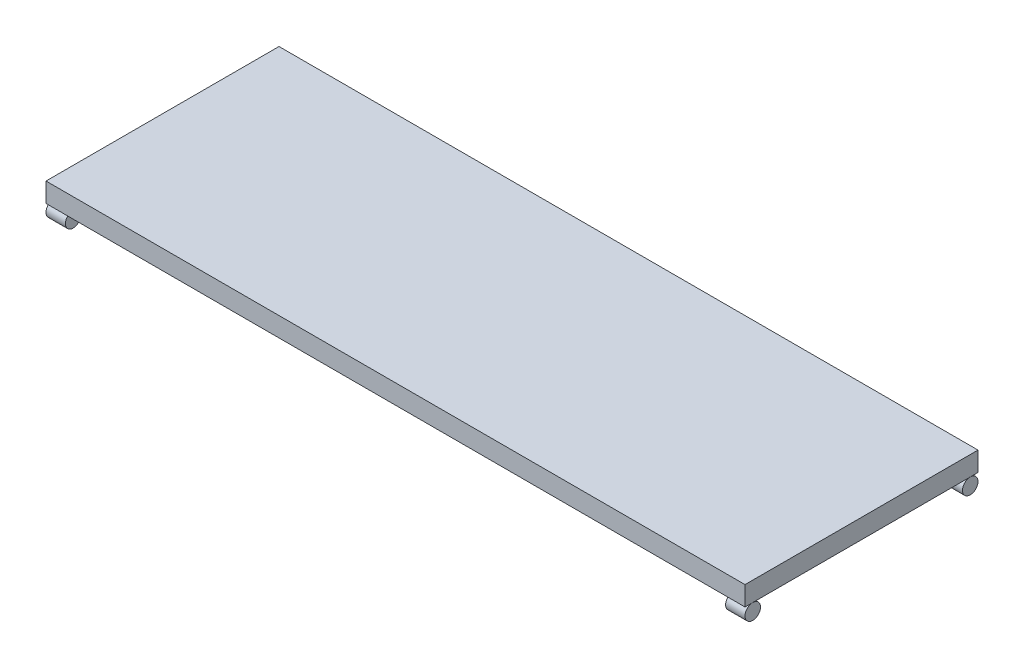
ISO-10303-21;
HEADER;
FILE_DESCRIPTION(('STEP AP214'),'2;1');
FILE_NAME('part.step','',(''),(''),'','','');
FILE_SCHEMA(('AUTOMOTIVE_DESIGN { 1 0 10303 214 1 1 1 1 }'));
ENDSEC;
DATA;
#1=APPLICATION_CONTEXT('core data for automotive mechanical design processes');
#2=APPLICATION_PROTOCOL_DEFINITION('international standard','automotive_design',2000,#1);
#3=PRODUCT_CONTEXT('',#1,'mechanical');
#4=PRODUCT('Part','Part','',(#3));
#5=PRODUCT_RELATED_PRODUCT_CATEGORY('part','',(#4));
#6=PRODUCT_DEFINITION_FORMATION('','',#4);
#7=PRODUCT_DEFINITION_CONTEXT('part definition',#1,'design');
#8=PRODUCT_DEFINITION('design','',#6,#7);
#9=PRODUCT_DEFINITION_SHAPE('','',#8);
#10=(LENGTH_UNIT() NAMED_UNIT(*) SI_UNIT(.MILLI.,.METRE.));
#11=(NAMED_UNIT(*) PLANE_ANGLE_UNIT() SI_UNIT($,.RADIAN.));
#12=(NAMED_UNIT(*) SI_UNIT($,.STERADIAN.) SOLID_ANGLE_UNIT());
#13=UNCERTAINTY_MEASURE_WITH_UNIT(LENGTH_MEASURE(1.E-05),#10,'distance_accuracy_value','');
#14=(GEOMETRIC_REPRESENTATION_CONTEXT(3) GLOBAL_UNCERTAINTY_ASSIGNED_CONTEXT((#13)) GLOBAL_UNIT_ASSIGNED_CONTEXT((#10,
#11,#12)) REPRESENTATION_CONTEXT('',''));
#15=CARTESIAN_POINT('',(0.,0.,0.));
#16=DIRECTION('',(0.,0.,1.));
#17=DIRECTION('',(1.,0.,0.));
#18=AXIS2_PLACEMENT_3D('',#15,#16,#17);
#19=CARTESIAN_POINT('',(1750.,-20.,-580.));
#20=DIRECTION('',(1.,0.,0.));
#21=DIRECTION('',(0.,0.,-1.));
#22=AXIS2_PLACEMENT_3D('',#19,#20,#21);
#23=CYLINDRICAL_SURFACE('',#22,20.);
#24=CARTESIAN_POINT('',(1750.,-20.,-580.));
#25=DIRECTION('',(1.,0.,0.));
#26=DIRECTION('',(0.,0.,-1.));
#27=AXIS2_PLACEMENT_3D('',#24,#25,#26);
#28=CIRCLE('',#27,20.);
#29=CARTESIAN_POINT('',(1750.,-20.,-600.));
#30=VERTEX_POINT('',#29);
#31=EDGE_CURVE('E11',#30,#30,#28,.T.);
#32=ORIENTED_EDGE('',*,*,#31,.T.);
#33=EDGE_LOOP('',(#32));
#34=FACE_BOUND('',#33,.T.);
#35=CARTESIAN_POINT('',(1800.,-20.,-580.));
#36=DIRECTION('',(1.,0.,0.));
#37=DIRECTION('',(0.,0.,-1.));
#38=AXIS2_PLACEMENT_3D('',#35,#36,#37);
#39=CIRCLE('',#38,20.);
#40=CARTESIAN_POINT('',(1800.,-20.,-600.));
#41=VERTEX_POINT('',#40);
#42=EDGE_CURVE('E45',#41,#41,#39,.T.);
#43=ORIENTED_EDGE('',*,*,#42,.F.);
#44=EDGE_LOOP('',(#43));
#45=FACE_BOUND('',#44,.T.);
#46=ADVANCED_FACE('F42',(#34,#45),#23,.T.);
#47=CARTESIAN_POINT('',(1750.,-20.,-580.));
#48=DIRECTION('',(1.,0.,0.));
#49=DIRECTION('',(0.,0.,-1.));
#50=AXIS2_PLACEMENT_3D('',#47,#48,#49);
#51=PLANE('',#50);
#52=ORIENTED_EDGE('',*,*,#31,.F.);
#53=EDGE_LOOP('',(#52));
#54=FACE_BOUND('',#53,.T.);
#55=ADVANCED_FACE('F57',(#54),#51,.F.);
#56=CARTESIAN_POINT('',(1800.,-20.,-580.));
#57=DIRECTION('',(1.,0.,0.));
#58=DIRECTION('',(0.,0.,-1.));
#59=AXIS2_PLACEMENT_3D('',#56,#57,#58);
#60=PLANE('',#59);
#61=ORIENTED_EDGE('',*,*,#42,.T.);
#62=EDGE_LOOP('',(#61));
#63=FACE_BOUND('',#62,.T.);
#64=ADVANCED_FACE('F54',(#63),#60,.T.);
#65=CLOSED_SHELL('',(#46,#55,#64));
#66=MANIFOLD_SOLID_BREP('B2',#65);
#67=CARTESIAN_POINT('',(1750.,-20.,-20.));
#68=DIRECTION('',(1.,0.,0.));
#69=DIRECTION('',(0.,0.,-1.));
#70=AXIS2_PLACEMENT_3D('',#67,#68,#69);
#71=CYLINDRICAL_SURFACE('',#70,20.);
#72=CARTESIAN_POINT('',(1750.,-20.,-20.));
#73=DIRECTION('',(1.,0.,0.));
#74=DIRECTION('',(0.,0.,-1.));
#75=AXIS2_PLACEMENT_3D('',#72,#73,#74);
#76=CIRCLE('',#75,20.);
#77=CARTESIAN_POINT('',(1750.,-20.,-40.));
#78=VERTEX_POINT('',#77);
#79=EDGE_CURVE('E41',#78,#78,#76,.T.);
#80=ORIENTED_EDGE('',*,*,#79,.T.);
#81=EDGE_LOOP('',(#80));
#82=FACE_BOUND('',#81,.T.);
#83=CARTESIAN_POINT('',(1800.,-20.,-20.));
#84=DIRECTION('',(1.,0.,0.));
#85=DIRECTION('',(0.,0.,-1.));
#86=AXIS2_PLACEMENT_3D('',#83,#84,#85);
#87=CIRCLE('',#86,20.);
#88=CARTESIAN_POINT('',(1800.,-20.,-40.));
#89=VERTEX_POINT('',#88);
#90=EDGE_CURVE('E94',#89,#89,#87,.T.);
#91=ORIENTED_EDGE('',*,*,#90,.F.);
#92=EDGE_LOOP('',(#91));
#93=FACE_BOUND('',#92,.T.);
#94=ADVANCED_FACE('F91',(#82,#93),#71,.T.);
#95=CARTESIAN_POINT('',(1750.,-20.,-20.));
#96=DIRECTION('',(1.,0.,0.));
#97=DIRECTION('',(0.,0.,-1.));
#98=AXIS2_PLACEMENT_3D('',#95,#96,#97);
#99=PLANE('',#98);
#100=ORIENTED_EDGE('',*,*,#79,.F.);
#101=EDGE_LOOP('',(#100));
#102=FACE_BOUND('',#101,.T.);
#103=ADVANCED_FACE('F106',(#102),#99,.F.);
#104=CARTESIAN_POINT('',(1800.,-20.,-20.));
#105=DIRECTION('',(1.,0.,0.));
#106=DIRECTION('',(0.,0.,-1.));
#107=AXIS2_PLACEMENT_3D('',#104,#105,#106);
#108=PLANE('',#107);
#109=ORIENTED_EDGE('',*,*,#90,.T.);
#110=EDGE_LOOP('',(#109));
#111=FACE_BOUND('',#110,.T.);
#112=ADVANCED_FACE('F103',(#111),#108,.T.);
#113=CLOSED_SHELL('',(#94,#103,#112));
#114=MANIFOLD_SOLID_BREP('B6',#113);
#115=CARTESIAN_POINT('',(50.,-20.,-580.));
#116=DIRECTION('',(-1.,0.,0.));
#117=DIRECTION('',(0.,0.,1.));
#118=AXIS2_PLACEMENT_3D('',#115,#116,#117);
#119=CYLINDRICAL_SURFACE('',#118,20.);
#120=CARTESIAN_POINT('',(50.,-20.,-580.));
#121=DIRECTION('',(1.,0.,0.));
#122=DIRECTION('',(0.,0.,-1.));
#123=AXIS2_PLACEMENT_3D('',#120,#121,#122);
#124=CIRCLE('',#123,20.);
#125=CARTESIAN_POINT('',(50.,-20.,-600.));
#126=VERTEX_POINT('',#125);
#127=EDGE_CURVE('E90',#126,#126,#124,.T.);
#128=ORIENTED_EDGE('',*,*,#127,.F.);
#129=EDGE_LOOP('',(#128));
#130=FACE_BOUND('',#129,.T.);
#131=CARTESIAN_POINT('',(0.,-20.,-580.));
#132=DIRECTION('',(1.,0.,0.));
#133=DIRECTION('',(0.,0.,-1.));
#134=AXIS2_PLACEMENT_3D('',#131,#132,#133);
#135=CIRCLE('',#134,20.);
#136=CARTESIAN_POINT('',(0.,-20.,-600.));
#137=VERTEX_POINT('',#136);
#138=EDGE_CURVE('E143',#137,#137,#135,.T.);
#139=ORIENTED_EDGE('',*,*,#138,.T.);
#140=EDGE_LOOP('',(#139));
#141=FACE_BOUND('',#140,.T.);
#142=ADVANCED_FACE('F140',(#130,#141),#119,.T.);
#143=CARTESIAN_POINT('',(50.,-20.,-580.));
#144=DIRECTION('',(1.,0.,0.));
#145=DIRECTION('',(0.,0.,-1.));
#146=AXIS2_PLACEMENT_3D('',#143,#144,#145);
#147=PLANE('',#146);
#148=ORIENTED_EDGE('',*,*,#127,.T.);
#149=EDGE_LOOP('',(#148));
#150=FACE_BOUND('',#149,.T.);
#151=ADVANCED_FACE('F155',(#150),#147,.T.);
#152=CARTESIAN_POINT('',(0.,-20.,-580.));
#153=DIRECTION('',(1.,0.,0.));
#154=DIRECTION('',(0.,0.,-1.));
#155=AXIS2_PLACEMENT_3D('',#152,#153,#154);
#156=PLANE('',#155);
#157=ORIENTED_EDGE('',*,*,#138,.F.);
#158=EDGE_LOOP('',(#157));
#159=FACE_BOUND('',#158,.T.);
#160=ADVANCED_FACE('F153',(#159),#156,.F.);
#161=CLOSED_SHELL('',(#142,#151,#160));
#162=MANIFOLD_SOLID_BREP('B36',#161);
#163=CARTESIAN_POINT('',(50.,-20.,-20.));
#164=DIRECTION('',(-1.,0.,0.));
#165=DIRECTION('',(0.,0.,1.));
#166=AXIS2_PLACEMENT_3D('',#163,#164,#165);
#167=CYLINDRICAL_SURFACE('',#166,20.);
#168=CARTESIAN_POINT('',(50.,-20.,-20.));
#169=DIRECTION('',(1.,0.,0.));
#170=DIRECTION('',(0.,0.,-1.));
#171=AXIS2_PLACEMENT_3D('',#168,#169,#170);
#172=CIRCLE('',#171,20.);
#173=CARTESIAN_POINT('',(50.,-20.,-40.));
#174=VERTEX_POINT('',#173);
#175=EDGE_CURVE('E139',#174,#174,#172,.T.);
#176=ORIENTED_EDGE('',*,*,#175,.F.);
#177=EDGE_LOOP('',(#176));
#178=FACE_BOUND('',#177,.T.);
#179=CARTESIAN_POINT('',(0.,-20.,-20.));
#180=DIRECTION('',(1.,0.,0.));
#181=DIRECTION('',(0.,0.,-1.));
#182=AXIS2_PLACEMENT_3D('',#179,#180,#181);
#183=CIRCLE('',#182,20.);
#184=CARTESIAN_POINT('',(0.,-20.,-40.));
#185=VERTEX_POINT('',#184);
#186=EDGE_CURVE('E193',#185,#185,#183,.T.);
#187=ORIENTED_EDGE('',*,*,#186,.T.);
#188=EDGE_LOOP('',(#187));
#189=FACE_BOUND('',#188,.T.);
#190=ADVANCED_FACE('F190',(#178,#189),#167,.T.);
#191=CARTESIAN_POINT('',(50.,-20.,-20.));
#192=DIRECTION('',(1.,0.,0.));
#193=DIRECTION('',(0.,0.,-1.));
#194=AXIS2_PLACEMENT_3D('',#191,#192,#193);
#195=PLANE('',#194);
#196=ORIENTED_EDGE('',*,*,#175,.T.);
#197=EDGE_LOOP('',(#196));
#198=FACE_BOUND('',#197,.T.);
#199=ADVANCED_FACE('F205',(#198),#195,.T.);
#200=CARTESIAN_POINT('',(0.,-20.,-20.));
#201=DIRECTION('',(1.,0.,0.));
#202=DIRECTION('',(0.,0.,-1.));
#203=AXIS2_PLACEMENT_3D('',#200,#201,#202);
#204=PLANE('',#203);
#205=ORIENTED_EDGE('',*,*,#186,.F.);
#206=EDGE_LOOP('',(#205));
#207=FACE_BOUND('',#206,.T.);
#208=ADVANCED_FACE('F203',(#207),#204,.F.);
#209=CLOSED_SHELL('',(#190,#199,#208));
#210=MANIFOLD_SOLID_BREP('B85',#209);
#211=CARTESIAN_POINT('',(0.,50.,0.));
#212=DIRECTION('',(1.,0.,0.));
#213=DIRECTION('',(0.,0.,-1.));
#214=AXIS2_PLACEMENT_3D('',#211,#212,#213);
#215=PLANE('',#214);
#216=DIRECTION('',(0.,0.,1.));
#217=VECTOR('',#216,1.);
#218=CARTESIAN_POINT('',(0.,0.,0.));
#219=LINE('',#218,#217);
#220=CARTESIAN_POINT('',(0.,0.,-600.));
#221=VERTEX_POINT('',#220);
#222=CARTESIAN_POINT('',(0.,0.,0.));
#223=VERTEX_POINT('',#222);
#224=EDGE_CURVE('E295',#221,#223,#219,.T.);
#225=ORIENTED_EDGE('',*,*,#224,.T.);
#226=DIRECTION('',(0.,-1.,0.));
#227=VECTOR('',#226,1.);
#228=CARTESIAN_POINT('',(0.,50.,0.));
#229=LINE('',#228,#227);
#230=CARTESIAN_POINT('',(0.,50.,0.));
#231=VERTEX_POINT('',#230);
#232=EDGE_CURVE('E188',#231,#223,#229,.T.);
#233=ORIENTED_EDGE('',*,*,#232,.F.);
#234=DIRECTION('',(0.,0.,1.));
#235=VECTOR('',#234,1.);
#236=CARTESIAN_POINT('',(0.,50.,0.));
#237=LINE('',#236,#235);
#238=CARTESIAN_POINT('',(0.,50.,-600.));
#239=VERTEX_POINT('',#238);
#240=EDGE_CURVE('E282',#239,#231,#237,.T.);
#241=ORIENTED_EDGE('',*,*,#240,.F.);
#242=DIRECTION('',(0.,-1.,0.));
#243=VECTOR('',#242,1.);
#244=CARTESIAN_POINT('',(0.,50.,-600.));
#245=LINE('',#244,#243);
#246=EDGE_CURVE('E291',#239,#221,#245,.T.);
#247=ORIENTED_EDGE('',*,*,#246,.T.);
#248=EDGE_LOOP('',(#225,#233,#241,#247));
#249=FACE_BOUND('',#248,.T.);
#250=ADVANCED_FACE('F231',(#249),#215,.F.);
#251=CARTESIAN_POINT('',(0.,50.,0.));
#252=DIRECTION('',(0.,0.,-1.));
#253=DIRECTION('',(-1.,0.,0.));
#254=AXIS2_PLACEMENT_3D('',#251,#252,#253);
#255=PLANE('',#254);
#256=DIRECTION('',(1.,0.,0.));
#257=VECTOR('',#256,1.);
#258=CARTESIAN_POINT('',(0.,0.,0.));
#259=LINE('',#258,#257);
#260=CARTESIAN_POINT('',(1800.,0.,0.));
#261=VERTEX_POINT('',#260);
#262=EDGE_CURVE('E287',#223,#261,#259,.T.);
#263=ORIENTED_EDGE('',*,*,#262,.T.);
#264=DIRECTION('',(0.,-1.,0.));
#265=VECTOR('',#264,1.);
#266=CARTESIAN_POINT('',(1800.,50.,0.));
#267=LINE('',#266,#265);
#268=CARTESIAN_POINT('',(1800.,50.,0.));
#269=VERTEX_POINT('',#268);
#270=EDGE_CURVE('E239',#269,#261,#267,.T.);
#271=ORIENTED_EDGE('',*,*,#270,.F.);
#272=DIRECTION('',(1.,0.,0.));
#273=VECTOR('',#272,1.);
#274=CARTESIAN_POINT('',(0.,50.,0.));
#275=LINE('',#274,#273);
#276=EDGE_CURVE('E277',#231,#269,#275,.T.);
#277=ORIENTED_EDGE('',*,*,#276,.F.);
#278=ORIENTED_EDGE('',*,*,#232,.T.);
#279=EDGE_LOOP('',(#263,#271,#277,#278));
#280=FACE_BOUND('',#279,.T.);
#281=ADVANCED_FACE('F285',(#280),#255,.F.);
#282=CARTESIAN_POINT('',(1800.,50.,0.));
#283=DIRECTION('',(-1.,0.,0.));
#284=DIRECTION('',(0.,0.,1.));
#285=AXIS2_PLACEMENT_3D('',#282,#283,#284);
#286=PLANE('',#285);
#287=DIRECTION('',(0.,0.,-1.));
#288=VECTOR('',#287,1.);
#289=CARTESIAN_POINT('',(1800.,0.,0.));
#290=LINE('',#289,#288);
#291=CARTESIAN_POINT('',(1800.,0.,-600.));
#292=VERTEX_POINT('',#291);
#293=EDGE_CURVE('E264',#261,#292,#290,.T.);
#294=ORIENTED_EDGE('',*,*,#293,.T.);
#295=DIRECTION('',(0.,-1.,0.));
#296=VECTOR('',#295,1.);
#297=CARTESIAN_POINT('',(1800.,50.,-600.));
#298=LINE('',#297,#296);
#299=CARTESIAN_POINT('',(1800.,50.,-600.));
#300=VERTEX_POINT('',#299);
#301=EDGE_CURVE('E288',#300,#292,#298,.T.);
#302=ORIENTED_EDGE('',*,*,#301,.F.);
#303=DIRECTION('',(0.,0.,-1.));
#304=VECTOR('',#303,1.);
#305=CARTESIAN_POINT('',(1800.,50.,0.));
#306=LINE('',#305,#304);
#307=EDGE_CURVE('E280',#269,#300,#306,.T.);
#308=ORIENTED_EDGE('',*,*,#307,.F.);
#309=ORIENTED_EDGE('',*,*,#270,.T.);
#310=EDGE_LOOP('',(#294,#302,#308,#309));
#311=FACE_BOUND('',#310,.T.);
#312=ADVANCED_FACE('F289',(#311),#286,.F.);
#313=CARTESIAN_POINT('',(0.,50.,-600.));
#314=DIRECTION('',(0.,0.,1.));
#315=DIRECTION('',(1.,0.,0.));
#316=AXIS2_PLACEMENT_3D('',#313,#314,#315);
#317=PLANE('',#316);
#318=DIRECTION('',(-1.,0.,0.));
#319=VECTOR('',#318,1.);
#320=CARTESIAN_POINT('',(0.,0.,-600.));
#321=LINE('',#320,#319);
#322=EDGE_CURVE('E270',#292,#221,#321,.T.);
#323=ORIENTED_EDGE('',*,*,#322,.T.);
#324=ORIENTED_EDGE('',*,*,#246,.F.);
#325=DIRECTION('',(-1.,0.,0.));
#326=VECTOR('',#325,1.);
#327=CARTESIAN_POINT('',(0.,50.,-600.));
#328=LINE('',#327,#326);
#329=EDGE_CURVE('E247',#300,#239,#328,.T.);
#330=ORIENTED_EDGE('',*,*,#329,.F.);
#331=ORIENTED_EDGE('',*,*,#301,.T.);
#332=EDGE_LOOP('',(#323,#324,#330,#331));
#333=FACE_BOUND('',#332,.T.);
#334=ADVANCED_FACE('F301',(#333),#317,.F.);
#335=CARTESIAN_POINT('',(0.,50.,0.));
#336=DIRECTION('',(0.,-1.,0.));
#337=DIRECTION('',(0.,0.,-1.));
#338=AXIS2_PLACEMENT_3D('',#335,#336,#337);
#339=PLANE('',#338);
#340=ORIENTED_EDGE('',*,*,#240,.T.);
#341=ORIENTED_EDGE('',*,*,#276,.T.);
#342=ORIENTED_EDGE('',*,*,#307,.T.);
#343=ORIENTED_EDGE('',*,*,#329,.T.);
#344=EDGE_LOOP('',(#340,#341,#342,#343));
#345=FACE_BOUND('',#344,.T.);
#346=ADVANCED_FACE('F278',(#345),#339,.F.);
#347=CARTESIAN_POINT('',(0.,0.,0.));
#348=DIRECTION('',(0.,-1.,0.));
#349=DIRECTION('',(0.,0.,-1.));
#350=AXIS2_PLACEMENT_3D('',#347,#348,#349);
#351=PLANE('',#350);
#352=ORIENTED_EDGE('',*,*,#322,.F.);
#353=ORIENTED_EDGE('',*,*,#293,.F.);
#354=ORIENTED_EDGE('',*,*,#262,.F.);
#355=ORIENTED_EDGE('',*,*,#224,.F.);
#356=EDGE_LOOP('',(#352,#353,#354,#355));
#357=FACE_BOUND('',#356,.T.);
#358=ADVANCED_FACE('F304',(#357),#351,.T.);
#359=CLOSED_SHELL('',(#250,#281,#312,#334,#346,#358));
#360=MANIFOLD_SOLID_BREP('B134',#359);
#361=ADVANCED_BREP_SHAPE_REPRESENTATION('',(#18,#66,#114,#162,#210,#360),#14);
#362=SHAPE_DEFINITION_REPRESENTATION(#9,#361);
ENDSEC;
END-ISO-10303-21;
